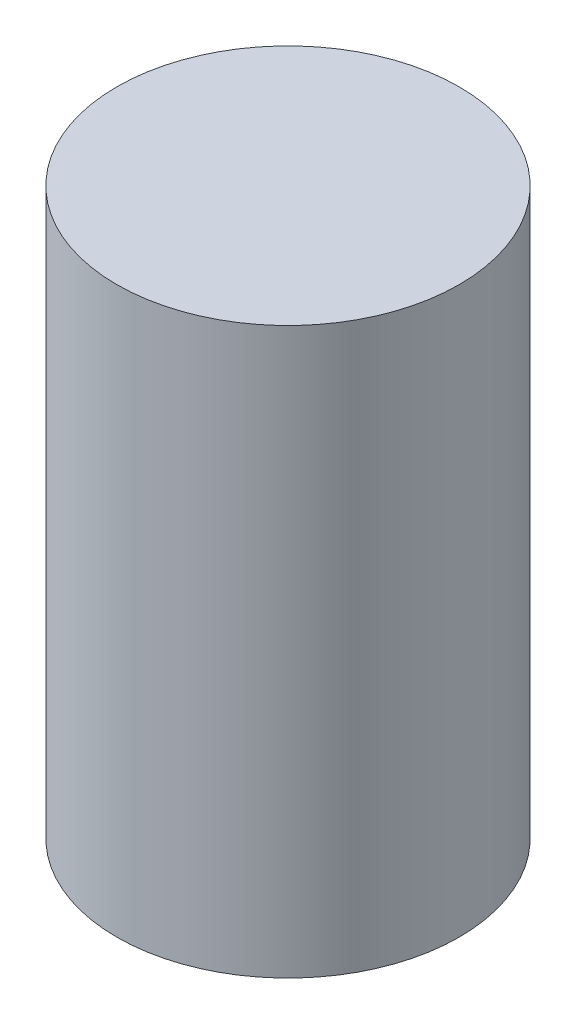
ISO-10303-21;
HEADER;
FILE_DESCRIPTION(('STEP AP214'),'2;1');
FILE_NAME('part.step','',(''),(''),'','','');
FILE_SCHEMA(('AUTOMOTIVE_DESIGN { 1 0 10303 214 1 1 1 1 }'));
ENDSEC;
DATA;
#1=APPLICATION_CONTEXT('core data for automotive mechanical design processes');
#2=APPLICATION_PROTOCOL_DEFINITION('international standard','automotive_design',2000,#1);
#3=PRODUCT_CONTEXT('',#1,'mechanical');
#4=PRODUCT('Part','Part','',(#3));
#5=PRODUCT_RELATED_PRODUCT_CATEGORY('part','',(#4));
#6=PRODUCT_DEFINITION_FORMATION('','',#4);
#7=PRODUCT_DEFINITION_CONTEXT('part definition',#1,'design');
#8=PRODUCT_DEFINITION('design','',#6,#7);
#9=PRODUCT_DEFINITION_SHAPE('','',#8);
#10=(LENGTH_UNIT() NAMED_UNIT(*) SI_UNIT(.MILLI.,.METRE.));
#11=(NAMED_UNIT(*) PLANE_ANGLE_UNIT() SI_UNIT($,.RADIAN.));
#12=(NAMED_UNIT(*) SI_UNIT($,.STERADIAN.) SOLID_ANGLE_UNIT());
#13=UNCERTAINTY_MEASURE_WITH_UNIT(LENGTH_MEASURE(1.E-05),#10,'distance_accuracy_value','');
#14=(GEOMETRIC_REPRESENTATION_CONTEXT(3) GLOBAL_UNCERTAINTY_ASSIGNED_CONTEXT((#13)) GLOBAL_UNIT_ASSIGNED_CONTEXT((#10,
#11,#12)) REPRESENTATION_CONTEXT('',''));
#15=CARTESIAN_POINT('',(0.,0.,0.));
#16=DIRECTION('',(0.,0.,1.));
#17=DIRECTION('',(1.,0.,0.));
#18=AXIS2_PLACEMENT_3D('',#15,#16,#17);
#19=CARTESIAN_POINT('',(0.,144.375,0.));
#20=DIRECTION('',(0.,-1.,0.));
#21=DIRECTION('',(0.,0.,-1.));
#22=AXIS2_PLACEMENT_3D('',#19,#20,#21);
#23=CYLINDRICAL_SURFACE('',#22,37.5);
#24=CARTESIAN_POINT('',(0.,144.375,0.));
#25=DIRECTION('',(0.,1.,0.));
#26=DIRECTION('',(0.,0.,1.));
#27=AXIS2_PLACEMENT_3D('',#24,#25,#26);
#28=CIRCLE('',#27,37.5);
#29=CARTESIAN_POINT('',(0.,144.375,37.5));
#30=VERTEX_POINT('',#29);
#31=EDGE_CURVE('E11',#30,#30,#28,.T.);
#32=ORIENTED_EDGE('',*,*,#31,.F.);
#33=EDGE_LOOP('',(#32));
#34=FACE_BOUND('',#33,.T.);
#35=CARTESIAN_POINT('',(0.,20.625,0.));
#36=DIRECTION('',(0.,1.,0.));
#37=DIRECTION('',(0.,0.,1.));
#38=AXIS2_PLACEMENT_3D('',#35,#36,#37);
#39=CIRCLE('',#38,37.5);
#40=CARTESIAN_POINT('',(0.,20.625,37.5));
#41=VERTEX_POINT('',#40);
#42=EDGE_CURVE('E47',#41,#41,#39,.T.);
#43=ORIENTED_EDGE('',*,*,#42,.T.);
#44=EDGE_LOOP('',(#43));
#45=FACE_BOUND('',#44,.T.);
#46=ADVANCED_FACE('F46',(#34,#45),#23,.T.);
#47=CARTESIAN_POINT('',(0.,144.375,0.));
#48=DIRECTION('',(0.,1.,0.));
#49=DIRECTION('',(0.,0.,1.));
#50=AXIS2_PLACEMENT_3D('',#47,#48,#49);
#51=PLANE('',#50);
#52=ORIENTED_EDGE('',*,*,#31,.T.);
#53=EDGE_LOOP('',(#52));
#54=FACE_BOUND('',#53,.T.);
#55=ADVANCED_FACE('F62',(#54),#51,.T.);
#56=CARTESIAN_POINT('',(0.,20.625,0.));
#57=DIRECTION('',(0.,1.,0.));
#58=DIRECTION('',(0.,0.,1.));
#59=AXIS2_PLACEMENT_3D('',#56,#57,#58);
#60=PLANE('',#59);
#61=ORIENTED_EDGE('',*,*,#42,.F.);
#62=EDGE_LOOP('',(#61));
#63=FACE_BOUND('',#62,.T.);
#64=ADVANCED_FACE('F56',(#63),#60,.F.);
#65=CLOSED_SHELL('',(#46,#55,#64));
#66=MANIFOLD_SOLID_BREP('B2',#65);
#67=ADVANCED_BREP_SHAPE_REPRESENTATION('',(#18,#66),#14);
#68=SHAPE_DEFINITION_REPRESENTATION(#9,#67);
ENDSEC;
END-ISO-10303-21;
